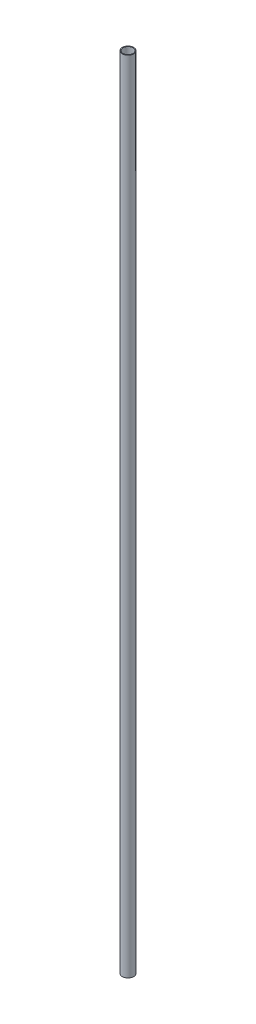
ISO-10303-21;
HEADER;
FILE_DESCRIPTION(('STEP AP214'),'2;1');
FILE_NAME('part.step','',(''),(''),'','','');
FILE_SCHEMA(('AUTOMOTIVE_DESIGN { 1 0 10303 214 1 1 1 1 }'));
ENDSEC;
DATA;
#1=APPLICATION_CONTEXT('core data for automotive mechanical design processes');
#2=APPLICATION_PROTOCOL_DEFINITION('international standard','automotive_design',2000,#1);
#3=PRODUCT_CONTEXT('',#1,'mechanical');
#4=PRODUCT('Part','Part','',(#3));
#5=PRODUCT_RELATED_PRODUCT_CATEGORY('part','',(#4));
#6=PRODUCT_DEFINITION_FORMATION('','',#4);
#7=PRODUCT_DEFINITION_CONTEXT('part definition',#1,'design');
#8=PRODUCT_DEFINITION('design','',#6,#7);
#9=PRODUCT_DEFINITION_SHAPE('','',#8);
#10=(LENGTH_UNIT() NAMED_UNIT(*) SI_UNIT(.MILLI.,.METRE.));
#11=(NAMED_UNIT(*) PLANE_ANGLE_UNIT() SI_UNIT($,.RADIAN.));
#12=(NAMED_UNIT(*) SI_UNIT($,.STERADIAN.) SOLID_ANGLE_UNIT());
#13=UNCERTAINTY_MEASURE_WITH_UNIT(LENGTH_MEASURE(1.E-05),#10,'distance_accuracy_value','');
#14=(GEOMETRIC_REPRESENTATION_CONTEXT(3) GLOBAL_UNCERTAINTY_ASSIGNED_CONTEXT((#13)) GLOBAL_UNIT_ASSIGNED_CONTEXT((#10,
#11,#12)) REPRESENTATION_CONTEXT('',''));
#15=CARTESIAN_POINT('',(0.,0.,0.));
#16=DIRECTION('',(0.,0.,1.));
#17=DIRECTION('',(1.,0.,0.));
#18=AXIS2_PLACEMENT_3D('',#15,#16,#17);
#19=CARTESIAN_POINT('',(0.,1130.,0.));
#20=DIRECTION('',(0.,1.,0.));
#21=DIRECTION('',(0.,0.,1.));
#22=AXIS2_PLACEMENT_3D('',#19,#20,#21);
#23=PLANE('',#22);
#24=CARTESIAN_POINT('',(0.,1130.,0.));
#25=DIRECTION('',(0.,1.,0.));
#26=DIRECTION('',(0.,0.,1.));
#27=AXIS2_PLACEMENT_3D('',#24,#25,#26);
#28=CIRCLE('',#27,8.);
#29=CARTESIAN_POINT('',(0.,1130.,8.));
#30=VERTEX_POINT('',#29);
#31=EDGE_CURVE('E10',#30,#30,#28,.T.);
#32=ORIENTED_EDGE('',*,*,#31,.T.);
#33=EDGE_LOOP('',(#32));
#34=FACE_BOUND('',#33,.T.);
#35=CARTESIAN_POINT('',(0.,1130.,0.));
#36=DIRECTION('',(0.,1.,0.));
#37=DIRECTION('',(0.,0.,1.));
#38=AXIS2_PLACEMENT_3D('',#35,#36,#37);
#39=CIRCLE('',#38,7.);
#40=CARTESIAN_POINT('',(0.,1130.,7.));
#41=VERTEX_POINT('',#40);
#42=EDGE_CURVE('E41',#41,#41,#39,.T.);
#43=ORIENTED_EDGE('',*,*,#42,.F.);
#44=EDGE_LOOP('',(#43));
#45=FACE_BOUND('',#44,.T.);
#46=ADVANCED_FACE('F30',(#34,#45),#23,.T.);
#47=CARTESIAN_POINT('',(0.,0.,0.));
#48=DIRECTION('',(0.,1.,0.));
#49=DIRECTION('',(0.,0.,1.));
#50=AXIS2_PLACEMENT_3D('',#47,#48,#49);
#51=PLANE('',#50);
#52=CARTESIAN_POINT('',(0.,0.,0.));
#53=DIRECTION('',(0.,1.,0.));
#54=DIRECTION('',(0.,0.,1.));
#55=AXIS2_PLACEMENT_3D('',#52,#53,#54);
#56=CIRCLE('',#55,8.);
#57=CARTESIAN_POINT('',(0.,0.,8.));
#58=VERTEX_POINT('',#57);
#59=EDGE_CURVE('E34',#58,#58,#56,.T.);
#60=ORIENTED_EDGE('',*,*,#59,.F.);
#61=EDGE_LOOP('',(#60));
#62=FACE_BOUND('',#61,.T.);
#63=CARTESIAN_POINT('',(0.,0.,0.));
#64=DIRECTION('',(0.,1.,0.));
#65=DIRECTION('',(0.,0.,1.));
#66=AXIS2_PLACEMENT_3D('',#63,#64,#65);
#67=CIRCLE('',#66,7.);
#68=CARTESIAN_POINT('',(0.,0.,7.));
#69=VERTEX_POINT('',#68);
#70=EDGE_CURVE('E43',#69,#69,#67,.T.);
#71=ORIENTED_EDGE('',*,*,#70,.T.);
#72=EDGE_LOOP('',(#71));
#73=FACE_BOUND('',#72,.T.);
#74=ADVANCED_FACE('F53',(#62,#73),#51,.F.);
#75=CARTESIAN_POINT('',(0.,1130.,0.));
#76=DIRECTION('',(0.,-1.,0.));
#77=DIRECTION('',(0.,0.,-1.));
#78=AXIS2_PLACEMENT_3D('',#75,#76,#77);
#79=CYLINDRICAL_SURFACE('',#78,8.);
#80=ORIENTED_EDGE('',*,*,#31,.F.);
#81=EDGE_LOOP('',(#80));
#82=FACE_BOUND('',#81,.T.);
#83=ORIENTED_EDGE('',*,*,#59,.T.);
#84=EDGE_LOOP('',(#83));
#85=FACE_BOUND('',#84,.T.);
#86=ADVANCED_FACE('F32',(#82,#85),#79,.T.);
#87=CARTESIAN_POINT('',(0.,1130.,0.));
#88=DIRECTION('',(0.,-1.,0.));
#89=DIRECTION('',(0.,0.,-1.));
#90=AXIS2_PLACEMENT_3D('',#87,#88,#89);
#91=CYLINDRICAL_SURFACE('',#90,7.);
#92=ORIENTED_EDGE('',*,*,#42,.T.);
#93=EDGE_LOOP('',(#92));
#94=FACE_BOUND('',#93,.T.);
#95=ORIENTED_EDGE('',*,*,#70,.F.);
#96=EDGE_LOOP('',(#95));
#97=FACE_BOUND('',#96,.T.);
#98=ADVANCED_FACE('F49',(#94,#97),#91,.F.);
#99=CLOSED_SHELL('',(#46,#74,#86,#98));
#100=MANIFOLD_SOLID_BREP('B2',#99);
#101=ADVANCED_BREP_SHAPE_REPRESENTATION('',(#18,#100),#14);
#102=SHAPE_DEFINITION_REPRESENTATION(#9,#101);
ENDSEC;
END-ISO-10303-21;
